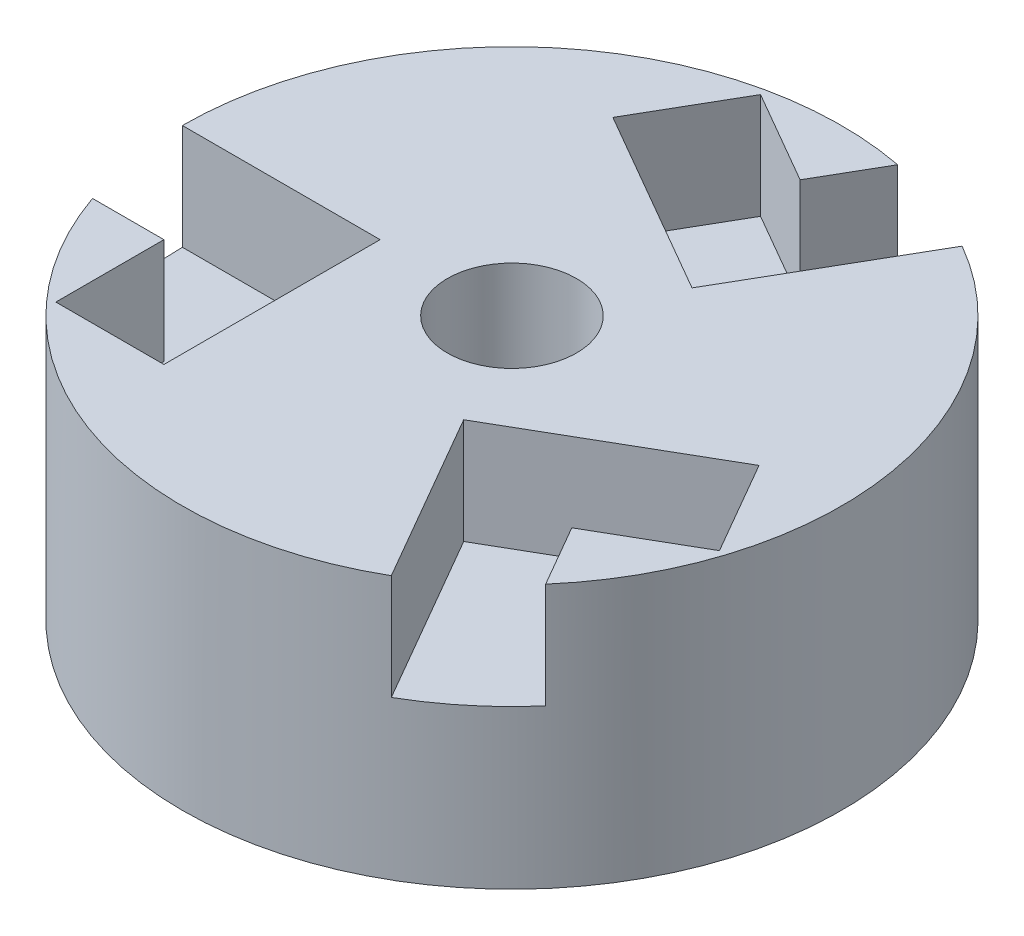
ISO-10303-21;
HEADER;
FILE_DESCRIPTION(('STEP AP214'),'2;1');
FILE_NAME('part.step','',(''),(''),'','','');
FILE_SCHEMA(('AUTOMOTIVE_DESIGN { 1 0 10303 214 1 1 1 1 }'));
ENDSEC;
DATA;
#1=APPLICATION_CONTEXT('core data for automotive mechanical design processes');
#2=APPLICATION_PROTOCOL_DEFINITION('international standard','automotive_design',2000,#1);
#3=PRODUCT_CONTEXT('',#1,'mechanical');
#4=PRODUCT('Part','Part','',(#3));
#5=PRODUCT_RELATED_PRODUCT_CATEGORY('part','',(#4));
#6=PRODUCT_DEFINITION_FORMATION('','',#4);
#7=PRODUCT_DEFINITION_CONTEXT('part definition',#1,'design');
#8=PRODUCT_DEFINITION('design','',#6,#7);
#9=PRODUCT_DEFINITION_SHAPE('','',#8);
#10=(LENGTH_UNIT() NAMED_UNIT(*) SI_UNIT(.MILLI.,.METRE.));
#11=(NAMED_UNIT(*) PLANE_ANGLE_UNIT() SI_UNIT($,.RADIAN.));
#12=(NAMED_UNIT(*) SI_UNIT($,.STERADIAN.) SOLID_ANGLE_UNIT());
#13=UNCERTAINTY_MEASURE_WITH_UNIT(LENGTH_MEASURE(1.E-05),#10,'distance_accuracy_value','');
#14=(GEOMETRIC_REPRESENTATION_CONTEXT(3) GLOBAL_UNCERTAINTY_ASSIGNED_CONTEXT((#13)) GLOBAL_UNIT_ASSIGNED_CONTEXT((#10,
#11,#12)) REPRESENTATION_CONTEXT('',''));
#15=CARTESIAN_POINT('',(0.,0.,0.));
#16=DIRECTION('',(0.,0.,1.));
#17=DIRECTION('',(1.,0.,0.));
#18=AXIS2_PLACEMENT_3D('',#15,#16,#17);
#19=CARTESIAN_POINT('',(0.,20.,0.));
#20=DIRECTION('',(0.,-1.,0.));
#21=DIRECTION('',(0.,0.,-1.));
#22=AXIS2_PLACEMENT_3D('',#19,#20,#21);
#23=CYLINDRICAL_SURFACE('',#22,25.);
#24=CARTESIAN_POINT('',(0.,12.,0.));
#25=DIRECTION('',(0.,1.,0.));
#26=DIRECTION('',(-0.866025403784436,0.,-0.500000000000004));
#27=AXIS2_PLACEMENT_3D('',#24,#25,#26);
#28=CIRCLE('',#27,25.);
#29=CARTESIAN_POINT('',(12.5000000000001,12.,-21.6506350946109));
#30=VERTEX_POINT('',#29);
#31=CARTESIAN_POINT('',(4.70706322426813,12.,-24.5528726588712));
#32=VERTEX_POINT('',#31);
#33=EDGE_CURVE('E173',#30,#32,#28,.T.);
#34=ORIENTED_EDGE('',*,*,#33,.F.);
#35=DIRECTION('',(0.,1.,0.));
#36=VECTOR('',#35,1.);
#37=CARTESIAN_POINT('',(12.5000000000001,12.,-21.6506350946109));
#38=LINE('',#37,#36);
#39=CARTESIAN_POINT('',(12.5000000000001,20.,-21.6506350946109));
#40=VERTEX_POINT('',#39);
#41=EDGE_CURVE('E264',#30,#40,#38,.T.);
#42=ORIENTED_EDGE('',*,*,#41,.T.);
#43=CARTESIAN_POINT('',(0.,20.,0.));
#44=DIRECTION('',(0.,1.,0.));
#45=DIRECTION('',(0.,0.,1.));
#46=AXIS2_PLACEMENT_3D('',#43,#44,#45);
#47=CIRCLE('',#46,25.);
#48=CARTESIAN_POINT('',(18.9098798463327,20.,16.3528726588714));
#49=VERTEX_POINT('',#48);
#50=EDGE_CURVE('E47',#49,#40,#47,.T.);
#51=ORIENTED_EDGE('',*,*,#50,.F.);
#52=DIRECTION('',(0.,1.,0.));
#53=VECTOR('',#52,1.);
#54=CARTESIAN_POINT('',(18.9098798463327,12.,16.3528726588714));
#55=LINE('',#54,#53);
#56=CARTESIAN_POINT('',(18.9098798463327,12.,16.3528726588714));
#57=VERTEX_POINT('',#56);
#58=EDGE_CURVE('E63',#57,#49,#55,.T.);
#59=ORIENTED_EDGE('',*,*,#58,.F.);
#60=CARTESIAN_POINT('',(0.,12.,0.));
#61=DIRECTION('',(0.,1.,0.));
#62=DIRECTION('',(0.866025403784443,0.,-0.499999999999992));
#63=AXIS2_PLACEMENT_3D('',#60,#61,#62);
#64=CIRCLE('',#63,25.);
#65=CARTESIAN_POINT('',(12.4999999999998,12.,21.6506350946111));
#66=VERTEX_POINT('',#65);
#67=EDGE_CURVE('E195',#66,#57,#64,.T.);
#68=ORIENTED_EDGE('',*,*,#67,.F.);
#69=DIRECTION('',(0.,1.,0.));
#70=VECTOR('',#69,1.);
#71=CARTESIAN_POINT('',(12.4999999999998,12.,21.6506350946111));
#72=LINE('',#71,#70);
#73=CARTESIAN_POINT('',(12.4999999999998,20.,21.6506350946111));
#74=VERTEX_POINT('',#73);
#75=EDGE_CURVE('E227',#66,#74,#72,.T.);
#76=ORIENTED_EDGE('',*,*,#75,.T.);
#77=CARTESIAN_POINT('',(-23.6169430706008,20.,8.2));
#78=VERTEX_POINT('',#77);
#79=EDGE_CURVE('E11',#78,#74,#47,.T.);
#80=ORIENTED_EDGE('',*,*,#79,.F.);
#81=DIRECTION('',(0.,1.,0.));
#82=VECTOR('',#81,1.);
#83=CARTESIAN_POINT('',(-23.6169430706008,12.,8.2));
#84=LINE('',#83,#82);
#85=CARTESIAN_POINT('',(-23.6169430706008,12.,8.2));
#86=VERTEX_POINT('',#85);
#87=EDGE_CURVE('E259',#86,#78,#84,.T.);
#88=ORIENTED_EDGE('',*,*,#87,.F.);
#89=CARTESIAN_POINT('',(0.,12.,0.));
#90=DIRECTION('',(0.,1.,0.));
#91=DIRECTION('',(0.,0.,1.));
#92=AXIS2_PLACEMENT_3D('',#89,#90,#91);
#93=CIRCLE('',#92,25.);
#94=CARTESIAN_POINT('',(-25.,12.,0.));
#95=VERTEX_POINT('',#94);
#96=EDGE_CURVE('E240',#95,#86,#93,.T.);
#97=ORIENTED_EDGE('',*,*,#96,.F.);
#98=DIRECTION('',(0.,1.,0.));
#99=VECTOR('',#98,1.);
#100=CARTESIAN_POINT('',(-25.,12.,0.));
#101=LINE('',#100,#99);
#102=CARTESIAN_POINT('',(-25.,20.,0.));
#103=VERTEX_POINT('',#102);
#104=EDGE_CURVE('E275',#95,#103,#101,.T.);
#105=ORIENTED_EDGE('',*,*,#104,.T.);
#106=CARTESIAN_POINT('',(4.70706322426812,20.,-24.5528726588712));
#107=VERTEX_POINT('',#106);
#108=EDGE_CURVE('E48',#107,#103,#47,.T.);
#109=ORIENTED_EDGE('',*,*,#108,.F.);
#110=DIRECTION('',(0.,1.,0.));
#111=VECTOR('',#110,1.);
#112=CARTESIAN_POINT('',(4.70706322426813,12.,-24.5528726588712));
#113=LINE('',#112,#111);
#114=EDGE_CURVE('E55',#32,#107,#113,.T.);
#115=ORIENTED_EDGE('',*,*,#114,.F.);
#116=EDGE_LOOP('',(#34,#42,#51,#59,#68,#76,#80,#88,#97,#105,#109,#115));
#117=FACE_BOUND('',#116,.T.);
#118=CARTESIAN_POINT('',(0.,0.,0.));
#119=DIRECTION('',(0.,1.,0.));
#120=DIRECTION('',(0.,0.,1.));
#121=AXIS2_PLACEMENT_3D('',#118,#119,#120);
#122=CIRCLE('',#121,25.);
#123=CARTESIAN_POINT('',(0.,0.,25.));
#124=VERTEX_POINT('',#123);
#125=EDGE_CURVE('E42',#124,#124,#122,.T.);
#126=ORIENTED_EDGE('',*,*,#125,.T.);
#127=EDGE_LOOP('',(#126));
#128=FACE_BOUND('',#127,.T.);
#129=ADVANCED_FACE('F39',(#117,#128),#23,.T.);
#130=CARTESIAN_POINT('',(0.,20.,0.));
#131=DIRECTION('',(0.,1.,0.));
#132=DIRECTION('',(0.,0.,1.));
#133=AXIS2_PLACEMENT_3D('',#130,#131,#132);
#134=PLANE('',#133);
#135=CARTESIAN_POINT('',(0.,20.,0.));
#136=DIRECTION('',(0.,-1.,0.));
#137=DIRECTION('',(0.,0.,-1.));
#138=AXIS2_PLACEMENT_3D('',#135,#136,#137);
#139=CIRCLE('',#138,4.9);
#140=CARTESIAN_POINT('',(0.,20.,-4.9));
#141=VERTEX_POINT('',#140);
#142=EDGE_CURVE('E548',#141,#141,#139,.T.);
#143=ORIENTED_EDGE('',*,*,#142,.T.);
#144=EDGE_LOOP('',(#143));
#145=FACE_BOUND('',#144,.T.);
#146=DIRECTION('',(0.500000000000004,0.,-0.866025403784436));
#147=VECTOR('',#146,1.);
#148=CARTESIAN_POINT('',(12.5000000000001,20.,-21.6506350946109));
#149=LINE('',#148,#147);
#150=CARTESIAN_POINT('',(5.00000000000004,20.,-8.66025403784437));
#151=VERTEX_POINT('',#150);
#152=EDGE_CURVE('E183',#151,#40,#149,.T.);
#153=ORIENTED_EDGE('',*,*,#152,.F.);
#154=DIRECTION('',(0.866025403784436,0.,0.500000000000004));
#155=VECTOR('',#154,1.);
#156=CARTESIAN_POINT('',(5.00000000000004,20.,-8.66025403784437));
#157=LINE('',#156,#155);
#158=CARTESIAN_POINT('',(-9.20281662206472,20.,-16.8602540378444));
#159=VERTEX_POINT('',#158);
#160=EDGE_CURVE('E572',#159,#151,#157,.T.);
#161=ORIENTED_EDGE('',*,*,#160,.F.);
#162=DIRECTION('',(-0.500000000000004,0.,0.866025403784436));
#163=VECTOR('',#162,1.);
#164=CARTESIAN_POINT('',(-9.20281662206472,20.,-16.8602540378444));
#165=LINE('',#164,#163);
#166=CARTESIAN_POINT('',(-5.10281662206468,20.,-23.9616623488768));
#167=VERTEX_POINT('',#166);
#168=EDGE_CURVE('E569',#167,#159,#165,.T.);
#169=ORIENTED_EDGE('',*,*,#168,.F.);
#170=DIRECTION('',(-0.866025403784436,0.,-0.500000000000004));
#171=VECTOR('',#170,1.);
#172=CARTESIAN_POINT('',(-5.10281662206468,20.,-23.9616623488768));
#173=LINE('',#172,#171);
#174=CARTESIAN_POINT('',(1.99859168896769,20.,-19.8616623488768));
#175=VERTEX_POINT('',#174);
#176=EDGE_CURVE('E566',#175,#167,#173,.T.);
#177=ORIENTED_EDGE('',*,*,#176,.F.);
#178=DIRECTION('',(-0.500000000000004,0.,0.866025403784437));
#179=VECTOR('',#178,1.);
#180=CARTESIAN_POINT('',(1.99859168896769,20.,-19.8616623488768));
#181=LINE('',#180,#179);
#182=EDGE_CURVE('E230',#107,#175,#181,.T.);
#183=ORIENTED_EDGE('',*,*,#182,.F.);
#184=ORIENTED_EDGE('',*,*,#108,.T.);
#185=DIRECTION('',(-1.,0.,0.));
#186=VECTOR('',#185,1.);
#187=CARTESIAN_POINT('',(-25.,20.,0.));
#188=LINE('',#187,#186);
#189=CARTESIAN_POINT('',(-10.,20.,0.));
#190=VERTEX_POINT('',#189);
#191=EDGE_CURVE('E244',#190,#103,#188,.T.);
#192=ORIENTED_EDGE('',*,*,#191,.F.);
#193=DIRECTION('',(0.,0.,-1.));
#194=VECTOR('',#193,1.);
#195=CARTESIAN_POINT('',(-10.,20.,0.));
#196=LINE('',#195,#194);
#197=CARTESIAN_POINT('',(-10.,20.,16.4));
#198=VERTEX_POINT('',#197);
#199=EDGE_CURVE('E270',#198,#190,#196,.T.);
#200=ORIENTED_EDGE('',*,*,#199,.F.);
#201=DIRECTION('',(1.,0.,0.));
#202=VECTOR('',#201,1.);
#203=CARTESIAN_POINT('',(-10.,20.,16.4));
#204=LINE('',#203,#202);
#205=CARTESIAN_POINT('',(-18.2,20.,16.4));
#206=VERTEX_POINT('',#205);
#207=EDGE_CURVE('E267',#206,#198,#204,.T.);
#208=ORIENTED_EDGE('',*,*,#207,.F.);
#209=DIRECTION('',(0.,0.,1.));
#210=VECTOR('',#209,1.);
#211=CARTESIAN_POINT('',(-18.2,20.,16.4));
#212=LINE('',#211,#210);
#213=CARTESIAN_POINT('',(-18.2,20.,8.2));
#214=VERTEX_POINT('',#213);
#215=EDGE_CURVE('E263',#214,#206,#212,.T.);
#216=ORIENTED_EDGE('',*,*,#215,.F.);
#217=DIRECTION('',(1.,0.,0.));
#218=VECTOR('',#217,1.);
#219=CARTESIAN_POINT('',(-18.2,20.,8.2));
#220=LINE('',#219,#218);
#221=EDGE_CURVE('E260',#78,#214,#220,.T.);
#222=ORIENTED_EDGE('',*,*,#221,.F.);
#223=ORIENTED_EDGE('',*,*,#79,.T.);
#224=DIRECTION('',(0.499999999999992,0.,0.866025403784443));
#225=VECTOR('',#224,1.);
#226=CARTESIAN_POINT('',(12.4999999999998,20.,21.6506350946111));
#227=LINE('',#226,#225);
#228=CARTESIAN_POINT('',(4.99999999999992,20.,8.66025403784443));
#229=VERTEX_POINT('',#228);
#230=EDGE_CURVE('E199',#229,#74,#227,.T.);
#231=ORIENTED_EDGE('',*,*,#230,.F.);
#232=DIRECTION('',(-0.866025403784443,0.,0.499999999999992));
#233=VECTOR('',#232,1.);
#234=CARTESIAN_POINT('',(4.99999999999992,20.,8.66025403784443));
#235=LINE('',#234,#233);
#236=CARTESIAN_POINT('',(19.2028166220648,20.,0.460254037844565));
#237=VERTEX_POINT('',#236);
#238=EDGE_CURVE('E223',#237,#229,#235,.T.);
#239=ORIENTED_EDGE('',*,*,#238,.F.);
#240=DIRECTION('',(-0.499999999999992,0.,-0.866025403784443));
#241=VECTOR('',#240,1.);
#242=CARTESIAN_POINT('',(19.2028166220648,20.,0.460254037844565));
#243=LINE('',#242,#241);
#244=CARTESIAN_POINT('',(23.3028166220647,20.,7.561662348877));
#245=VERTEX_POINT('',#244);
#246=EDGE_CURVE('E220',#245,#237,#243,.T.);
#247=ORIENTED_EDGE('',*,*,#246,.F.);
#248=DIRECTION('',(0.866025403784443,0.,-0.499999999999992));
#249=VECTOR('',#248,1.);
#250=CARTESIAN_POINT('',(23.3028166220647,20.,7.561662348877));
#251=LINE('',#250,#249);
#252=CARTESIAN_POINT('',(16.2014083110323,20.,11.6616623488769));
#253=VERTEX_POINT('',#252);
#254=EDGE_CURVE('E216',#253,#245,#251,.T.);
#255=ORIENTED_EDGE('',*,*,#254,.F.);
#256=DIRECTION('',(-0.499999999999992,0.,-0.866025403784443));
#257=VECTOR('',#256,1.);
#258=CARTESIAN_POINT('',(16.2014083110323,20.,11.6616623488769));
#259=LINE('',#258,#257);
#260=EDGE_CURVE('E214',#49,#253,#259,.T.);
#261=ORIENTED_EDGE('',*,*,#260,.F.);
#262=ORIENTED_EDGE('',*,*,#50,.T.);
#263=EDGE_LOOP('',(#153,#161,#169,#177,#183,#184,#192,#200,#208,#216,#222,#223,#231,#239,#247,
#255,#261,#262));
#264=FACE_BOUND('',#263,.T.);
#265=ADVANCED_FACE('F294',(#145,#264),#134,.T.);
#266=CARTESIAN_POINT('',(0.,0.,0.));
#267=DIRECTION('',(0.,1.,0.));
#268=DIRECTION('',(0.,0.,1.));
#269=AXIS2_PLACEMENT_3D('',#266,#267,#268);
#270=PLANE('',#269);
#271=CARTESIAN_POINT('',(0.,0.,0.));
#272=DIRECTION('',(0.,-1.,0.));
#273=DIRECTION('',(0.,0.,-1.));
#274=AXIS2_PLACEMENT_3D('',#271,#272,#273);
#275=CIRCLE('',#274,15.1);
#276=CARTESIAN_POINT('',(0.,0.,-15.1));
#277=VERTEX_POINT('',#276);
#278=EDGE_CURVE('E553',#277,#277,#275,.T.);
#279=ORIENTED_EDGE('',*,*,#278,.F.);
#280=EDGE_LOOP('',(#279));
#281=FACE_BOUND('',#280,.T.);
#282=ORIENTED_EDGE('',*,*,#125,.F.);
#283=EDGE_LOOP('',(#282));
#284=FACE_BOUND('',#283,.T.);
#285=ADVANCED_FACE('F322',(#281,#284),#270,.F.);
#286=CARTESIAN_POINT('',(-25.,12.,0.));
#287=DIRECTION('',(0.,0.,-1.));
#288=DIRECTION('',(-1.,0.,0.));
#289=AXIS2_PLACEMENT_3D('',#286,#287,#288);
#290=PLANE('',#289);
#291=ORIENTED_EDGE('',*,*,#191,.T.);
#292=ORIENTED_EDGE('',*,*,#104,.F.);
#293=DIRECTION('',(-1.,0.,0.));
#294=VECTOR('',#293,1.);
#295=CARTESIAN_POINT('',(-25.,12.,0.));
#296=LINE('',#295,#294);
#297=CARTESIAN_POINT('',(-10.,12.,0.));
#298=VERTEX_POINT('',#297);
#299=EDGE_CURVE('E256',#298,#95,#296,.T.);
#300=ORIENTED_EDGE('',*,*,#299,.F.);
#301=DIRECTION('',(0.,1.,0.));
#302=VECTOR('',#301,1.);
#303=CARTESIAN_POINT('',(-10.,12.,0.));
#304=LINE('',#303,#302);
#305=EDGE_CURVE('E277',#298,#190,#304,.T.);
#306=ORIENTED_EDGE('',*,*,#305,.T.);
#307=EDGE_LOOP('',(#291,#292,#300,#306));
#308=FACE_BOUND('',#307,.T.);
#309=ADVANCED_FACE('F324',(#308),#290,.F.);
#310=CARTESIAN_POINT('',(-10.,12.,0.));
#311=DIRECTION('',(1.,0.,0.));
#312=DIRECTION('',(0.,0.,-1.));
#313=AXIS2_PLACEMENT_3D('',#310,#311,#312);
#314=PLANE('',#313);
#315=ORIENTED_EDGE('',*,*,#199,.T.);
#316=ORIENTED_EDGE('',*,*,#305,.F.);
#317=DIRECTION('',(0.,0.,-1.));
#318=VECTOR('',#317,1.);
#319=CARTESIAN_POINT('',(-10.,12.,0.));
#320=LINE('',#319,#318);
#321=CARTESIAN_POINT('',(-10.,12.,16.4));
#322=VERTEX_POINT('',#321);
#323=EDGE_CURVE('E253',#322,#298,#320,.T.);
#324=ORIENTED_EDGE('',*,*,#323,.F.);
#325=DIRECTION('',(0.,1.,0.));
#326=VECTOR('',#325,1.);
#327=CARTESIAN_POINT('',(-10.,12.,16.4));
#328=LINE('',#327,#326);
#329=EDGE_CURVE('E279',#322,#198,#328,.T.);
#330=ORIENTED_EDGE('',*,*,#329,.T.);
#331=EDGE_LOOP('',(#315,#316,#324,#330));
#332=FACE_BOUND('',#331,.T.);
#333=ADVANCED_FACE('F331',(#332),#314,.F.);
#334=CARTESIAN_POINT('',(-10.,12.,16.4));
#335=DIRECTION('',(0.,0.,1.));
#336=DIRECTION('',(1.,0.,0.));
#337=AXIS2_PLACEMENT_3D('',#334,#335,#336);
#338=PLANE('',#337);
#339=ORIENTED_EDGE('',*,*,#207,.T.);
#340=ORIENTED_EDGE('',*,*,#329,.F.);
#341=DIRECTION('',(1.,0.,0.));
#342=VECTOR('',#341,1.);
#343=CARTESIAN_POINT('',(-10.,12.,16.4));
#344=LINE('',#343,#342);
#345=CARTESIAN_POINT('',(-18.2,12.,16.4));
#346=VERTEX_POINT('',#345);
#347=EDGE_CURVE('E250',#346,#322,#344,.T.);
#348=ORIENTED_EDGE('',*,*,#347,.F.);
#349=DIRECTION('',(0.,1.,0.));
#350=VECTOR('',#349,1.);
#351=CARTESIAN_POINT('',(-18.2,12.,16.4));
#352=LINE('',#351,#350);
#353=EDGE_CURVE('E281',#346,#206,#352,.T.);
#354=ORIENTED_EDGE('',*,*,#353,.T.);
#355=EDGE_LOOP('',(#339,#340,#348,#354));
#356=FACE_BOUND('',#355,.T.);
#357=ADVANCED_FACE('F478',(#356),#338,.F.);
#358=CARTESIAN_POINT('',(-18.2,12.,16.4));
#359=DIRECTION('',(-1.,0.,0.));
#360=DIRECTION('',(0.,0.,1.));
#361=AXIS2_PLACEMENT_3D('',#358,#359,#360);
#362=PLANE('',#361);
#363=ORIENTED_EDGE('',*,*,#215,.T.);
#364=ORIENTED_EDGE('',*,*,#353,.F.);
#365=DIRECTION('',(0.,0.,1.));
#366=VECTOR('',#365,1.);
#367=CARTESIAN_POINT('',(-18.2,12.,16.4));
#368=LINE('',#367,#366);
#369=CARTESIAN_POINT('',(-18.2,12.,8.2));
#370=VERTEX_POINT('',#369);
#371=EDGE_CURVE('E247',#370,#346,#368,.T.);
#372=ORIENTED_EDGE('',*,*,#371,.F.);
#373=DIRECTION('',(0.,1.,0.));
#374=VECTOR('',#373,1.);
#375=CARTESIAN_POINT('',(-18.2,12.,8.2));
#376=LINE('',#375,#374);
#377=EDGE_CURVE('E283',#370,#214,#376,.T.);
#378=ORIENTED_EDGE('',*,*,#377,.T.);
#379=EDGE_LOOP('',(#363,#364,#372,#378));
#380=FACE_BOUND('',#379,.T.);
#381=ADVANCED_FACE('F482',(#380),#362,.F.);
#382=CARTESIAN_POINT('',(-18.2,12.,8.2));
#383=DIRECTION('',(0.,0.,1.));
#384=DIRECTION('',(1.,0.,0.));
#385=AXIS2_PLACEMENT_3D('',#382,#383,#384);
#386=PLANE('',#385);
#387=ORIENTED_EDGE('',*,*,#221,.T.);
#388=ORIENTED_EDGE('',*,*,#377,.F.);
#389=DIRECTION('',(1.,0.,0.));
#390=VECTOR('',#389,1.);
#391=CARTESIAN_POINT('',(-18.2,12.,8.2));
#392=LINE('',#391,#390);
#393=EDGE_CURVE('E243',#86,#370,#392,.T.);
#394=ORIENTED_EDGE('',*,*,#393,.F.);
#395=ORIENTED_EDGE('',*,*,#87,.T.);
#396=EDGE_LOOP('',(#387,#388,#394,#395));
#397=FACE_BOUND('',#396,.T.);
#398=ADVANCED_FACE('F288',(#397),#386,.F.);
#399=CARTESIAN_POINT('',(0.,12.,0.));
#400=DIRECTION('',(0.,1.,0.));
#401=DIRECTION('',(0.,0.,1.));
#402=AXIS2_PLACEMENT_3D('',#399,#400,#401);
#403=PLANE('',#402);
#404=ORIENTED_EDGE('',*,*,#96,.T.);
#405=ORIENTED_EDGE('',*,*,#393,.T.);
#406=ORIENTED_EDGE('',*,*,#371,.T.);
#407=ORIENTED_EDGE('',*,*,#347,.T.);
#408=ORIENTED_EDGE('',*,*,#323,.T.);
#409=ORIENTED_EDGE('',*,*,#299,.T.);
#410=EDGE_LOOP('',(#404,#405,#406,#407,#408,#409));
#411=FACE_BOUND('',#410,.T.);
#412=ADVANCED_FACE('F347',(#411),#403,.T.);
#413=CARTESIAN_POINT('',(12.4999999999998,12.,21.6506350946111));
#414=DIRECTION('',(-0.866025403784443,0.,0.499999999999992));
#415=DIRECTION('',(0.499999999999992,0.,0.866025403784443));
#416=AXIS2_PLACEMENT_3D('',#413,#414,#415);
#417=PLANE('',#416);
#418=ORIENTED_EDGE('',*,*,#230,.T.);
#419=ORIENTED_EDGE('',*,*,#75,.F.);
#420=DIRECTION('',(0.499999999999992,0.,0.866025403784443));
#421=VECTOR('',#420,1.);
#422=CARTESIAN_POINT('',(12.4999999999998,12.,21.6506350946111));
#423=LINE('',#422,#421);
#424=CARTESIAN_POINT('',(4.99999999999992,12.,8.66025403784443));
#425=VERTEX_POINT('',#424);
#426=EDGE_CURVE('E211',#425,#66,#423,.T.);
#427=ORIENTED_EDGE('',*,*,#426,.F.);
#428=DIRECTION('',(0.,1.,0.));
#429=VECTOR('',#428,1.);
#430=CARTESIAN_POINT('',(4.99999999999992,12.,8.66025403784443));
#431=LINE('',#430,#429);
#432=EDGE_CURVE('E231',#425,#229,#431,.T.);
#433=ORIENTED_EDGE('',*,*,#432,.T.);
#434=EDGE_LOOP('',(#418,#419,#427,#433));
#435=FACE_BOUND('',#434,.T.);
#436=ADVANCED_FACE('F300',(#435),#417,.F.);
#437=CARTESIAN_POINT('',(4.99999999999992,12.,8.66025403784443));
#438=DIRECTION('',(-0.499999999999992,0.,-0.866025403784443));
#439=DIRECTION('',(-0.866025403784443,0.,0.499999999999992));
#440=AXIS2_PLACEMENT_3D('',#437,#438,#439);
#441=PLANE('',#440);
#442=ORIENTED_EDGE('',*,*,#238,.T.);
#443=ORIENTED_EDGE('',*,*,#432,.F.);
#444=DIRECTION('',(-0.866025403784443,0.,0.499999999999992));
#445=VECTOR('',#444,1.);
#446=CARTESIAN_POINT('',(4.99999999999992,12.,8.66025403784443));
#447=LINE('',#446,#445);
#448=CARTESIAN_POINT('',(19.2028166220648,12.,0.460254037844565));
#449=VERTEX_POINT('',#448);
#450=EDGE_CURVE('E208',#449,#425,#447,.T.);
#451=ORIENTED_EDGE('',*,*,#450,.F.);
#452=DIRECTION('',(0.,1.,0.));
#453=VECTOR('',#452,1.);
#454=CARTESIAN_POINT('',(19.2028166220648,12.,0.460254037844565));
#455=LINE('',#454,#453);
#456=EDGE_CURVE('E233',#449,#237,#455,.T.);
#457=ORIENTED_EDGE('',*,*,#456,.T.);
#458=EDGE_LOOP('',(#442,#443,#451,#457));
#459=FACE_BOUND('',#458,.T.);
#460=ADVANCED_FACE('F306',(#459),#441,.F.);
#461=CARTESIAN_POINT('',(19.2028166220648,12.,0.460254037844565));
#462=DIRECTION('',(0.866025403784443,0.,-0.499999999999992));
#463=DIRECTION('',(-0.499999999999992,0.,-0.866025403784443));
#464=AXIS2_PLACEMENT_3D('',#461,#462,#463);
#465=PLANE('',#464);
#466=ORIENTED_EDGE('',*,*,#246,.T.);
#467=ORIENTED_EDGE('',*,*,#456,.F.);
#468=DIRECTION('',(-0.499999999999992,0.,-0.866025403784443));
#469=VECTOR('',#468,1.);
#470=CARTESIAN_POINT('',(19.2028166220648,12.,0.460254037844565));
#471=LINE('',#470,#469);
#472=CARTESIAN_POINT('',(23.3028166220647,12.,7.561662348877));
#473=VERTEX_POINT('',#472);
#474=EDGE_CURVE('E205',#473,#449,#471,.T.);
#475=ORIENTED_EDGE('',*,*,#474,.F.);
#476=DIRECTION('',(0.,1.,0.));
#477=VECTOR('',#476,1.);
#478=CARTESIAN_POINT('',(23.3028166220647,12.,7.561662348877));
#479=LINE('',#478,#477);
#480=EDGE_CURVE('E235',#473,#245,#479,.T.);
#481=ORIENTED_EDGE('',*,*,#480,.T.);
#482=EDGE_LOOP('',(#466,#467,#475,#481));
#483=FACE_BOUND('',#482,.T.);
#484=ADVANCED_FACE('F311',(#483),#465,.F.);
#485=CARTESIAN_POINT('',(23.3028166220647,12.,7.561662348877));
#486=DIRECTION('',(0.499999999999992,0.,0.866025403784443));
#487=DIRECTION('',(0.866025403784443,0.,-0.499999999999992));
#488=AXIS2_PLACEMENT_3D('',#485,#486,#487);
#489=PLANE('',#488);
#490=ORIENTED_EDGE('',*,*,#254,.T.);
#491=ORIENTED_EDGE('',*,*,#480,.F.);
#492=DIRECTION('',(0.866025403784443,0.,-0.499999999999992));
#493=VECTOR('',#492,1.);
#494=CARTESIAN_POINT('',(23.3028166220647,12.,7.561662348877));
#495=LINE('',#494,#493);
#496=CARTESIAN_POINT('',(16.2014083110323,12.,11.6616623488769));
#497=VERTEX_POINT('',#496);
#498=EDGE_CURVE('E202',#497,#473,#495,.T.);
#499=ORIENTED_EDGE('',*,*,#498,.F.);
#500=DIRECTION('',(0.,1.,0.));
#501=VECTOR('',#500,1.);
#502=CARTESIAN_POINT('',(16.2014083110323,12.,11.6616623488769));
#503=LINE('',#502,#501);
#504=EDGE_CURVE('E237',#497,#253,#503,.T.);
#505=ORIENTED_EDGE('',*,*,#504,.T.);
#506=EDGE_LOOP('',(#490,#491,#499,#505));
#507=FACE_BOUND('',#506,.T.);
#508=ADVANCED_FACE('F314',(#507),#489,.F.);
#509=CARTESIAN_POINT('',(16.2014083110323,12.,11.6616623488769));
#510=DIRECTION('',(0.866025403784443,0.,-0.499999999999992));
#511=DIRECTION('',(-0.499999999999992,0.,-0.866025403784443));
#512=AXIS2_PLACEMENT_3D('',#509,#510,#511);
#513=PLANE('',#512);
#514=ORIENTED_EDGE('',*,*,#260,.T.);
#515=ORIENTED_EDGE('',*,*,#504,.F.);
#516=DIRECTION('',(-0.499999999999992,0.,-0.866025403784443));
#517=VECTOR('',#516,1.);
#518=CARTESIAN_POINT('',(16.2014083110323,12.,11.6616623488769));
#519=LINE('',#518,#517);
#520=EDGE_CURVE('E198',#57,#497,#519,.T.);
#521=ORIENTED_EDGE('',*,*,#520,.F.);
#522=ORIENTED_EDGE('',*,*,#58,.T.);
#523=EDGE_LOOP('',(#514,#515,#521,#522));
#524=FACE_BOUND('',#523,.T.);
#525=ADVANCED_FACE('F315',(#524),#513,.F.);
#526=CARTESIAN_POINT('',(0.,12.,0.));
#527=DIRECTION('',(0.,1.,0.));
#528=DIRECTION('',(0.866025403784443,0.,-0.499999999999992));
#529=AXIS2_PLACEMENT_3D('',#526,#527,#528);
#530=PLANE('',#529);
#531=ORIENTED_EDGE('',*,*,#67,.T.);
#532=ORIENTED_EDGE('',*,*,#520,.T.);
#533=ORIENTED_EDGE('',*,*,#498,.T.);
#534=ORIENTED_EDGE('',*,*,#474,.T.);
#535=ORIENTED_EDGE('',*,*,#450,.T.);
#536=ORIENTED_EDGE('',*,*,#426,.T.);
#537=EDGE_LOOP('',(#531,#532,#533,#534,#535,#536));
#538=FACE_BOUND('',#537,.T.);
#539=ADVANCED_FACE('F302',(#538),#530,.T.);
#540=CARTESIAN_POINT('',(12.5000000000001,12.,-21.6506350946109));
#541=DIRECTION('',(0.866025403784436,0.,0.500000000000004));
#542=DIRECTION('',(0.500000000000004,0.,-0.866025403784436));
#543=AXIS2_PLACEMENT_3D('',#540,#541,#542);
#544=PLANE('',#543);
#545=ORIENTED_EDGE('',*,*,#152,.T.);
#546=ORIENTED_EDGE('',*,*,#41,.F.);
#547=DIRECTION('',(0.500000000000004,0.,-0.866025403784436));
#548=VECTOR('',#547,1.);
#549=CARTESIAN_POINT('',(12.5000000000001,12.,-21.6506350946109));
#550=LINE('',#549,#548);
#551=CARTESIAN_POINT('',(5.00000000000004,12.,-8.66025403784437));
#552=VERTEX_POINT('',#551);
#553=EDGE_CURVE('E180',#552,#30,#550,.T.);
#554=ORIENTED_EDGE('',*,*,#553,.F.);
#555=DIRECTION('',(0.,1.,0.));
#556=VECTOR('',#555,1.);
#557=CARTESIAN_POINT('',(5.00000000000004,12.,-8.66025403784437));
#558=LINE('',#557,#556);
#559=EDGE_CURVE('E577',#552,#151,#558,.T.);
#560=ORIENTED_EDGE('',*,*,#559,.T.);
#561=EDGE_LOOP('',(#545,#546,#554,#560));
#562=FACE_BOUND('',#561,.T.);
#563=ADVANCED_FACE('F389',(#562),#544,.F.);
#564=CARTESIAN_POINT('',(5.00000000000004,12.,-8.66025403784437));
#565=DIRECTION('',(-0.500000000000004,0.,0.866025403784436));
#566=DIRECTION('',(0.866025403784436,0.,0.500000000000004));
#567=AXIS2_PLACEMENT_3D('',#564,#565,#566);
#568=PLANE('',#567);
#569=ORIENTED_EDGE('',*,*,#160,.T.);
#570=ORIENTED_EDGE('',*,*,#559,.F.);
#571=DIRECTION('',(0.866025403784436,0.,0.500000000000004));
#572=VECTOR('',#571,1.);
#573=CARTESIAN_POINT('',(5.00000000000004,12.,-8.66025403784437));
#574=LINE('',#573,#572);
#575=CARTESIAN_POINT('',(-9.20281662206472,12.,-16.8602540378444));
#576=VERTEX_POINT('',#575);
#577=EDGE_CURVE('E191',#576,#552,#574,.T.);
#578=ORIENTED_EDGE('',*,*,#577,.F.);
#579=DIRECTION('',(0.,1.,0.));
#580=VECTOR('',#579,1.);
#581=CARTESIAN_POINT('',(-9.20281662206472,12.,-16.8602540378444));
#582=LINE('',#581,#580);
#583=EDGE_CURVE('E579',#576,#159,#582,.T.);
#584=ORIENTED_EDGE('',*,*,#583,.T.);
#585=EDGE_LOOP('',(#569,#570,#578,#584));
#586=FACE_BOUND('',#585,.T.);
#587=ADVANCED_FACE('F397',(#586),#568,.F.);
#588=CARTESIAN_POINT('',(-9.20281662206472,12.,-16.8602540378444));
#589=DIRECTION('',(-0.866025403784436,0.,-0.500000000000004));
#590=DIRECTION('',(-0.500000000000004,0.,0.866025403784436));
#591=AXIS2_PLACEMENT_3D('',#588,#589,#590);
#592=PLANE('',#591);
#593=ORIENTED_EDGE('',*,*,#168,.T.);
#594=ORIENTED_EDGE('',*,*,#583,.F.);
#595=DIRECTION('',(-0.500000000000004,0.,0.866025403784436));
#596=VECTOR('',#595,1.);
#597=CARTESIAN_POINT('',(-9.20281662206472,12.,-16.8602540378444));
#598=LINE('',#597,#596);
#599=CARTESIAN_POINT('',(-5.10281662206468,12.,-23.9616623488768));
#600=VERTEX_POINT('',#599);
#601=EDGE_CURVE('E561',#600,#576,#598,.T.);
#602=ORIENTED_EDGE('',*,*,#601,.F.);
#603=DIRECTION('',(0.,1.,0.));
#604=VECTOR('',#603,1.);
#605=CARTESIAN_POINT('',(-5.10281662206468,12.,-23.9616623488768));
#606=LINE('',#605,#604);
#607=EDGE_CURVE('E189',#600,#167,#606,.T.);
#608=ORIENTED_EDGE('',*,*,#607,.T.);
#609=EDGE_LOOP('',(#593,#594,#602,#608));
#610=FACE_BOUND('',#609,.T.);
#611=ADVANCED_FACE('F406',(#610),#592,.F.);
#612=CARTESIAN_POINT('',(-5.10281662206468,12.,-23.9616623488768));
#613=DIRECTION('',(0.500000000000004,0.,-0.866025403784436));
#614=DIRECTION('',(-0.866025403784436,0.,-0.500000000000004));
#615=AXIS2_PLACEMENT_3D('',#612,#613,#614);
#616=PLANE('',#615);
#617=ORIENTED_EDGE('',*,*,#176,.T.);
#618=ORIENTED_EDGE('',*,*,#607,.F.);
#619=DIRECTION('',(-0.866025403784436,0.,-0.500000000000004));
#620=VECTOR('',#619,1.);
#621=CARTESIAN_POINT('',(-5.10281662206468,12.,-23.9616623488768));
#622=LINE('',#621,#620);
#623=CARTESIAN_POINT('',(1.99859168896769,12.,-19.8616623488768));
#624=VERTEX_POINT('',#623);
#625=EDGE_CURVE('E172',#624,#600,#622,.T.);
#626=ORIENTED_EDGE('',*,*,#625,.F.);
#627=DIRECTION('',(0.,1.,0.));
#628=VECTOR('',#627,1.);
#629=CARTESIAN_POINT('',(1.99859168896769,12.,-19.8616623488768));
#630=LINE('',#629,#628);
#631=EDGE_CURVE('E168',#624,#175,#630,.T.);
#632=ORIENTED_EDGE('',*,*,#631,.T.);
#633=EDGE_LOOP('',(#617,#618,#626,#632));
#634=FACE_BOUND('',#633,.T.);
#635=ADVANCED_FACE('F415',(#634),#616,.F.);
#636=CARTESIAN_POINT('',(1.99859168896769,12.,-19.8616623488768));
#637=DIRECTION('',(-0.866025403784436,0.,-0.500000000000004));
#638=DIRECTION('',(-0.500000000000004,0.,0.866025403784436));
#639=AXIS2_PLACEMENT_3D('',#636,#637,#638);
#640=PLANE('',#639);
#641=ORIENTED_EDGE('',*,*,#182,.T.);
#642=ORIENTED_EDGE('',*,*,#631,.F.);
#643=DIRECTION('',(-0.500000000000004,0.,0.866025403784437));
#644=VECTOR('',#643,1.);
#645=CARTESIAN_POINT('',(1.99859168896769,12.,-19.8616623488768));
#646=LINE('',#645,#644);
#647=EDGE_CURVE('E165',#32,#624,#646,.T.);
#648=ORIENTED_EDGE('',*,*,#647,.F.);
#649=ORIENTED_EDGE('',*,*,#114,.T.);
#650=EDGE_LOOP('',(#641,#642,#648,#649));
#651=FACE_BOUND('',#650,.T.);
#652=ADVANCED_FACE('F167',(#651),#640,.F.);
#653=CARTESIAN_POINT('',(0.,12.,0.));
#654=DIRECTION('',(0.,1.,0.));
#655=DIRECTION('',(-0.866025403784436,0.,-0.500000000000004));
#656=AXIS2_PLACEMENT_3D('',#653,#654,#655);
#657=PLANE('',#656);
#658=ORIENTED_EDGE('',*,*,#33,.T.);
#659=ORIENTED_EDGE('',*,*,#647,.T.);
#660=ORIENTED_EDGE('',*,*,#625,.T.);
#661=ORIENTED_EDGE('',*,*,#601,.T.);
#662=ORIENTED_EDGE('',*,*,#577,.T.);
#663=ORIENTED_EDGE('',*,*,#553,.T.);
#664=EDGE_LOOP('',(#658,#659,#660,#661,#662,#663));
#665=FACE_BOUND('',#664,.T.);
#666=ADVANCED_FACE('F177',(#665),#657,.T.);
#667=CARTESIAN_POINT('',(0.,8.7,0.));
#668=DIRECTION('',(0.,-1.,0.));
#669=DIRECTION('',(0.,0.,-1.));
#670=AXIS2_PLACEMENT_3D('',#667,#668,#669);
#671=CYLINDRICAL_SURFACE('',#670,15.1);
#672=CARTESIAN_POINT('',(0.,8.7,0.));
#673=DIRECTION('',(0.,-1.,0.));
#674=DIRECTION('',(0.,0.,-1.));
#675=AXIS2_PLACEMENT_3D('',#672,#673,#674);
#676=CIRCLE('',#675,15.1);
#677=CARTESIAN_POINT('',(0.,8.7,-15.1));
#678=VERTEX_POINT('',#677);
#679=EDGE_CURVE('E217',#678,#678,#676,.T.);
#680=ORIENTED_EDGE('',*,*,#679,.F.);
#681=EDGE_LOOP('',(#680));
#682=FACE_BOUND('',#681,.T.);
#683=ORIENTED_EDGE('',*,*,#278,.T.);
#684=EDGE_LOOP('',(#683));
#685=FACE_BOUND('',#684,.T.);
#686=ADVANCED_FACE('F437',(#682,#685),#671,.F.);
#687=CARTESIAN_POINT('',(0.,8.7,0.));
#688=DIRECTION('',(0.,-1.,0.));
#689=DIRECTION('',(0.,0.,-1.));
#690=AXIS2_PLACEMENT_3D('',#687,#688,#689);
#691=PLANE('',#690);
#692=CARTESIAN_POINT('',(0.,8.7,0.));
#693=DIRECTION('',(0.,-1.,0.));
#694=DIRECTION('',(0.,0.,-1.));
#695=AXIS2_PLACEMENT_3D('',#692,#693,#694);
#696=CIRCLE('',#695,4.9);
#697=CARTESIAN_POINT('',(0.,8.7,-4.9));
#698=VERTEX_POINT('',#697);
#699=EDGE_CURVE('E551',#698,#698,#696,.T.);
#700=ORIENTED_EDGE('',*,*,#699,.F.);
#701=EDGE_LOOP('',(#700));
#702=FACE_BOUND('',#701,.T.);
#703=ORIENTED_EDGE('',*,*,#679,.T.);
#704=EDGE_LOOP('',(#703));
#705=FACE_BOUND('',#704,.T.);
#706=ADVANCED_FACE('F448',(#702,#705),#691,.T.);
#707=CARTESIAN_POINT('',(0.,20.,0.));
#708=DIRECTION('',(0.,-1.,0.));
#709=DIRECTION('',(0.,0.,-1.));
#710=AXIS2_PLACEMENT_3D('',#707,#708,#709);
#711=CYLINDRICAL_SURFACE('',#710,4.9);
#712=ORIENTED_EDGE('',*,*,#142,.F.);
#713=EDGE_LOOP('',(#712));
#714=FACE_BOUND('',#713,.T.);
#715=ORIENTED_EDGE('',*,*,#699,.T.);
#716=EDGE_LOOP('',(#715));
#717=FACE_BOUND('',#716,.T.);
#718=ADVANCED_FACE('F458',(#714,#717),#711,.F.);
#719=CLOSED_SHELL('',(#129,#265,#285,#309,#333,#357,#381,#398,#412,#436,#460,#484,#508,#525,
#539,#563,#587,#611,#635,#652,#666,#686,#706,#718));
#720=MANIFOLD_SOLID_BREP('B2',#719);
#721=ADVANCED_BREP_SHAPE_REPRESENTATION('',(#18,#720),#14);
#722=SHAPE_DEFINITION_REPRESENTATION(#9,#721);
ENDSEC;
END-ISO-10303-21;
